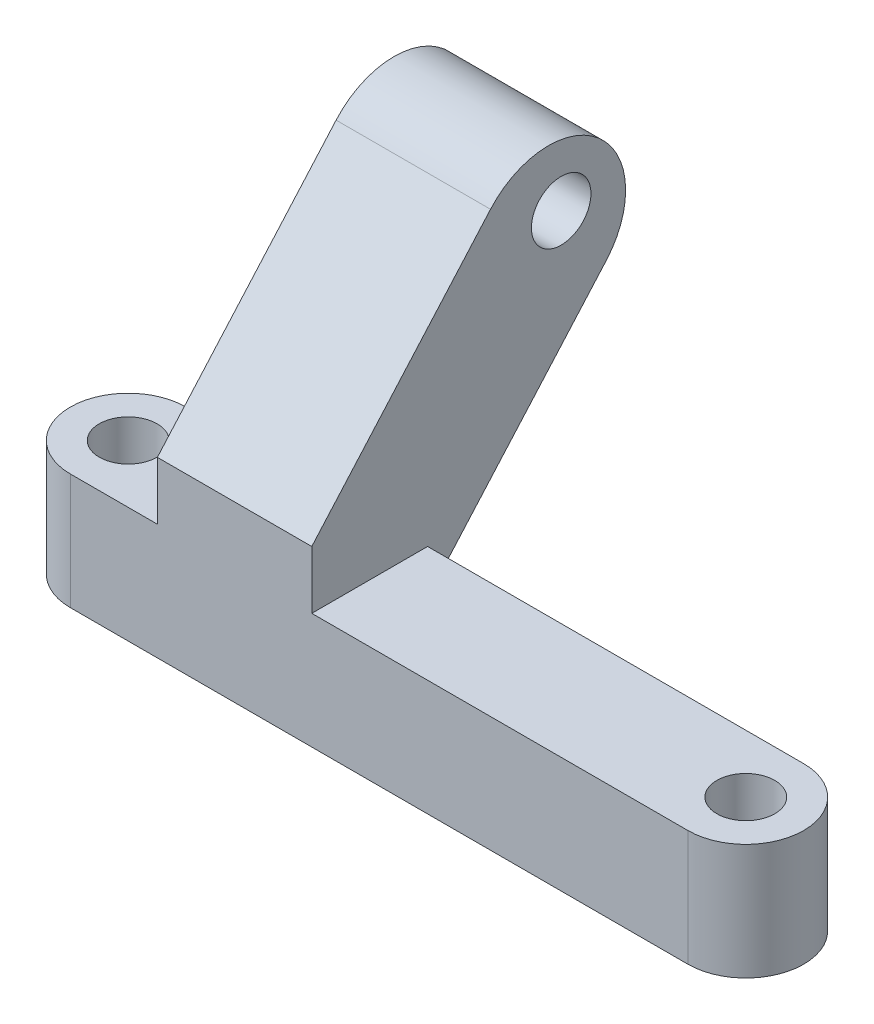
ISO-10303-21;
HEADER;
FILE_DESCRIPTION(('STEP AP214'),'2;1');
FILE_NAME('part.step','',(''),(''),'','','');
FILE_SCHEMA(('AUTOMOTIVE_DESIGN { 1 0 10303 214 1 1 1 1 }'));
ENDSEC;
DATA;
#1=APPLICATION_CONTEXT('core data for automotive mechanical design processes');
#2=APPLICATION_PROTOCOL_DEFINITION('international standard','automotive_design',2000,#1);
#3=PRODUCT_CONTEXT('',#1,'mechanical');
#4=PRODUCT('Part','Part','',(#3));
#5=PRODUCT_RELATED_PRODUCT_CATEGORY('part','',(#4));
#6=PRODUCT_DEFINITION_FORMATION('','',#4);
#7=PRODUCT_DEFINITION_CONTEXT('part definition',#1,'design');
#8=PRODUCT_DEFINITION('design','',#6,#7);
#9=PRODUCT_DEFINITION_SHAPE('','',#8);
#10=(LENGTH_UNIT() NAMED_UNIT(*) SI_UNIT(.MILLI.,.METRE.));
#11=(NAMED_UNIT(*) PLANE_ANGLE_UNIT() SI_UNIT($,.RADIAN.));
#12=(NAMED_UNIT(*) SI_UNIT($,.STERADIAN.) SOLID_ANGLE_UNIT());
#13=UNCERTAINTY_MEASURE_WITH_UNIT(LENGTH_MEASURE(1.E-05),#10,'distance_accuracy_value','');
#14=(GEOMETRIC_REPRESENTATION_CONTEXT(3) GLOBAL_UNCERTAINTY_ASSIGNED_CONTEXT((#13)) GLOBAL_UNIT_ASSIGNED_CONTEXT((#10,
#11,#12)) REPRESENTATION_CONTEXT('',''));
#15=CARTESIAN_POINT('',(0.,0.,0.));
#16=DIRECTION('',(0.,0.,1.));
#17=DIRECTION('',(1.,0.,0.));
#18=AXIS2_PLACEMENT_3D('',#15,#16,#17);
#19=CARTESIAN_POINT('',(0.,-6.,-3.));
#20=DIRECTION('',(0.,0.,1.));
#21=DIRECTION('',(1.,0.,0.));
#22=AXIS2_PLACEMENT_3D('',#19,#20,#21);
#23=PLANE('',#22);
#24=DIRECTION('',(0.,1.,0.));
#25=VECTOR('',#24,1.);
#26=CARTESIAN_POINT('',(-34.1646688359455,-6.,-3.));
#27=LINE('',#26,#25);
#28=CARTESIAN_POINT('',(-34.1646688359455,-2.2915026221292,-3.));
#29=VERTEX_POINT('',#28);
#30=CARTESIAN_POINT('',(-34.1646688359455,0.,-3.));
#31=VERTEX_POINT('',#30);
#32=EDGE_CURVE('E70',#29,#31,#27,.T.);
#33=ORIENTED_EDGE('',*,*,#32,.F.);
#34=DIRECTION('',(1.,0.,0.));
#35=VECTOR('',#34,1.);
#36=CARTESIAN_POINT('',(-34.1646688359455,-2.2915026221292,-3.));
#37=LINE('',#36,#35);
#38=CARTESIAN_POINT('',(-26.1646688359455,-2.2915026221292,-3.));
#39=VERTEX_POINT('',#38);
#40=EDGE_CURVE('E75',#29,#39,#37,.T.);
#41=ORIENTED_EDGE('',*,*,#40,.T.);
#42=DIRECTION('',(0.,1.,0.));
#43=VECTOR('',#42,1.);
#44=CARTESIAN_POINT('',(-26.1646688359455,-6.,-3.));
#45=LINE('',#44,#43);
#46=CARTESIAN_POINT('',(-26.1646688359455,0.,-3.));
#47=VERTEX_POINT('',#46);
#48=EDGE_CURVE('E157',#39,#47,#45,.T.);
#49=ORIENTED_EDGE('',*,*,#48,.T.);
#50=DIRECTION('',(1.,0.,0.));
#51=VECTOR('',#50,1.);
#52=CARTESIAN_POINT('',(0.,0.,-3.));
#53=LINE('',#52,#51);
#54=CARTESIAN_POINT('',(-6.67696888733747,0.,-3.));
#55=VERTEX_POINT('',#54);
#56=EDGE_CURVE('E200',#47,#55,#53,.T.);
#57=ORIENTED_EDGE('',*,*,#56,.T.);
#58=DIRECTION('',(0.,1.,0.));
#59=VECTOR('',#58,1.);
#60=CARTESIAN_POINT('',(-6.67696888733747,-6.,-3.));
#61=LINE('',#60,#59);
#62=CARTESIAN_POINT('',(-6.67696888733747,-6.,-3.));
#63=VERTEX_POINT('',#62);
#64=EDGE_CURVE('E221',#63,#55,#61,.T.);
#65=ORIENTED_EDGE('',*,*,#64,.F.);
#66=DIRECTION('',(1.,0.,0.));
#67=VECTOR('',#66,1.);
#68=CARTESIAN_POINT('',(0.,-6.,-3.));
#69=LINE('',#68,#67);
#70=CARTESIAN_POINT('',(-38.6769688873375,-6.,-3.));
#71=VERTEX_POINT('',#70);
#72=EDGE_CURVE('E240',#71,#63,#69,.T.);
#73=ORIENTED_EDGE('',*,*,#72,.F.);
#74=DIRECTION('',(0.,1.,0.));
#75=VECTOR('',#74,1.);
#76=CARTESIAN_POINT('',(-38.6769688873375,-6.,-3.));
#77=LINE('',#76,#75);
#78=CARTESIAN_POINT('',(-38.6769688873375,0.,-3.));
#79=VERTEX_POINT('',#78);
#80=EDGE_CURVE('E62',#71,#79,#77,.T.);
#81=ORIENTED_EDGE('',*,*,#80,.T.);
#82=EDGE_CURVE('E203',#79,#31,#53,.T.);
#83=ORIENTED_EDGE('',*,*,#82,.T.);
#84=EDGE_LOOP('',(#33,#41,#49,#57,#65,#73,#81,#83));
#85=FACE_BOUND('',#84,.T.);
#86=ADVANCED_FACE('F53',(#85),#23,.F.);
#87=CARTESIAN_POINT('',(0.,0.,0.));
#88=DIRECTION('',(0.,1.,0.));
#89=DIRECTION('',(0.,0.,1.));
#90=AXIS2_PLACEMENT_3D('',#87,#88,#89);
#91=PLANE('',#90);
#92=CARTESIAN_POINT('',(-6.67696888733747,0.,0.));
#93=DIRECTION('',(0.,1.,0.));
#94=DIRECTION('',(0.,0.,1.));
#95=AXIS2_PLACEMENT_3D('',#92,#93,#94);
#96=CIRCLE('',#95,1.5);
#97=CARTESIAN_POINT('',(-6.67696888733747,0.,1.5));
#98=VERTEX_POINT('',#97);
#99=EDGE_CURVE('E216',#98,#98,#96,.T.);
#100=ORIENTED_EDGE('',*,*,#99,.F.);
#101=EDGE_LOOP('',(#100));
#102=FACE_BOUND('',#101,.T.);
#103=ORIENTED_EDGE('',*,*,#56,.F.);
#104=DIRECTION('',(0.,0.,1.));
#105=VECTOR('',#104,1.);
#106=CARTESIAN_POINT('',(-26.1646688359455,0.,0.));
#107=LINE('',#106,#105);
#108=CARTESIAN_POINT('',(-26.1646688359455,0.,3.));
#109=VERTEX_POINT('',#108);
#110=EDGE_CURVE('E171',#47,#109,#107,.T.);
#111=ORIENTED_EDGE('',*,*,#110,.T.);
#112=DIRECTION('',(1.,0.,0.));
#113=VECTOR('',#112,1.);
#114=CARTESIAN_POINT('',(0.,0.,3.));
#115=LINE('',#114,#113);
#116=CARTESIAN_POINT('',(-6.67696888733747,0.,3.));
#117=VERTEX_POINT('',#116);
#118=EDGE_CURVE('E192',#109,#117,#115,.T.);
#119=ORIENTED_EDGE('',*,*,#118,.T.);
#120=CARTESIAN_POINT('',(-6.67696888733747,0.,0.));
#121=DIRECTION('',(0.,1.,0.));
#122=DIRECTION('',(0.,0.,1.));
#123=AXIS2_PLACEMENT_3D('',#120,#121,#122);
#124=CIRCLE('',#123,3.);
#125=EDGE_CURVE('E204',#117,#55,#124,.T.);
#126=ORIENTED_EDGE('',*,*,#125,.T.);
#127=EDGE_LOOP('',(#103,#111,#119,#126));
#128=FACE_BOUND('',#127,.T.);
#129=ADVANCED_FACE('F264',(#102,#128),#91,.T.);
#130=CARTESIAN_POINT('',(0.,-6.,3.));
#131=DIRECTION('',(0.,0.,1.));
#132=DIRECTION('',(1.,0.,0.));
#133=AXIS2_PLACEMENT_3D('',#130,#131,#132);
#134=PLANE('',#133);
#135=CARTESIAN_POINT('',(-38.6769688873375,0.,3.));
#136=VERTEX_POINT('',#135);
#137=CARTESIAN_POINT('',(-34.1646688359455,0.,3.));
#138=VERTEX_POINT('',#137);
#139=EDGE_CURVE('E196',#136,#138,#115,.T.);
#140=ORIENTED_EDGE('',*,*,#139,.F.);
#141=DIRECTION('',(0.,1.,0.));
#142=VECTOR('',#141,1.);
#143=CARTESIAN_POINT('',(-38.6769688873375,-6.,3.));
#144=LINE('',#143,#142);
#145=CARTESIAN_POINT('',(-38.6769688873375,-6.,3.));
#146=VERTEX_POINT('',#145);
#147=EDGE_CURVE('E12',#146,#136,#144,.T.);
#148=ORIENTED_EDGE('',*,*,#147,.F.);
#149=DIRECTION('',(1.,0.,0.));
#150=VECTOR('',#149,1.);
#151=CARTESIAN_POINT('',(0.,-6.,3.));
#152=LINE('',#151,#150);
#153=CARTESIAN_POINT('',(-6.67696888733747,-6.,3.));
#154=VERTEX_POINT('',#153);
#155=EDGE_CURVE('E218',#146,#154,#152,.T.);
#156=ORIENTED_EDGE('',*,*,#155,.T.);
#157=DIRECTION('',(0.,1.,0.));
#158=VECTOR('',#157,1.);
#159=CARTESIAN_POINT('',(-6.67696888733747,-6.,3.));
#160=LINE('',#159,#158);
#161=EDGE_CURVE('E224',#154,#117,#160,.T.);
#162=ORIENTED_EDGE('',*,*,#161,.T.);
#163=ORIENTED_EDGE('',*,*,#118,.F.);
#164=DIRECTION('',(0.,-1.,0.));
#165=VECTOR('',#164,1.);
#166=CARTESIAN_POINT('',(-26.1646688359455,3.,3.));
#167=LINE('',#166,#165);
#168=CARTESIAN_POINT('',(-26.1646688359455,3.,3.));
#169=VERTEX_POINT('',#168);
#170=EDGE_CURVE('E175',#169,#109,#167,.T.);
#171=ORIENTED_EDGE('',*,*,#170,.F.);
#172=DIRECTION('',(1.,0.,0.));
#173=VECTOR('',#172,1.);
#174=CARTESIAN_POINT('',(0.,3.,3.));
#175=LINE('',#174,#173);
#176=CARTESIAN_POINT('',(-34.1646688359455,3.,3.));
#177=VERTEX_POINT('',#176);
#178=EDGE_CURVE('E172',#177,#169,#175,.T.);
#179=ORIENTED_EDGE('',*,*,#178,.F.);
#180=DIRECTION('',(0.,-1.,0.));
#181=VECTOR('',#180,1.);
#182=CARTESIAN_POINT('',(-34.1646688359455,3.,3.));
#183=LINE('',#182,#181);
#184=EDGE_CURVE('E187',#177,#138,#183,.T.);
#185=ORIENTED_EDGE('',*,*,#184,.T.);
#186=EDGE_LOOP('',(#140,#148,#156,#162,#163,#171,#179,#185));
#187=FACE_BOUND('',#186,.T.);
#188=ADVANCED_FACE('F55',(#187),#134,.T.);
#189=CARTESIAN_POINT('',(-38.6769688873375,-6.,0.));
#190=DIRECTION('',(0.,1.,0.));
#191=DIRECTION('',(0.,0.,1.));
#192=AXIS2_PLACEMENT_3D('',#189,#190,#191);
#193=CYLINDRICAL_SURFACE('',#192,3.);
#194=CARTESIAN_POINT('',(-38.6769688873375,0.,0.));
#195=DIRECTION('',(0.,1.,0.));
#196=DIRECTION('',(0.,0.,1.));
#197=AXIS2_PLACEMENT_3D('',#194,#195,#196);
#198=CIRCLE('',#197,3.);
#199=EDGE_CURVE('E209',#79,#136,#198,.T.);
#200=ORIENTED_EDGE('',*,*,#199,.F.);
#201=ORIENTED_EDGE('',*,*,#80,.F.);
#202=CARTESIAN_POINT('',(-38.6769688873375,-6.,0.));
#203=DIRECTION('',(0.,1.,0.));
#204=DIRECTION('',(0.,0.,1.));
#205=AXIS2_PLACEMENT_3D('',#202,#203,#204);
#206=CIRCLE('',#205,3.);
#207=EDGE_CURVE('E237',#71,#146,#206,.T.);
#208=ORIENTED_EDGE('',*,*,#207,.T.);
#209=ORIENTED_EDGE('',*,*,#147,.T.);
#210=EDGE_LOOP('',(#200,#201,#208,#209));
#211=FACE_BOUND('',#210,.T.);
#212=ADVANCED_FACE('F255',(#211),#193,.T.);
#213=CARTESIAN_POINT('',(-38.6769688873375,-6.,0.));
#214=DIRECTION('',(0.,1.,0.));
#215=DIRECTION('',(0.,0.,1.));
#216=AXIS2_PLACEMENT_3D('',#213,#214,#215);
#217=CYLINDRICAL_SURFACE('',#216,1.5);
#218=CARTESIAN_POINT('',(-38.6769688873375,-6.,0.));
#219=DIRECTION('',(0.,1.,0.));
#220=DIRECTION('',(0.,0.,1.));
#221=AXIS2_PLACEMENT_3D('',#218,#219,#220);
#222=CIRCLE('',#221,1.5);
#223=CARTESIAN_POINT('',(-38.6769688873375,-6.,1.5));
#224=VERTEX_POINT('',#223);
#225=EDGE_CURVE('E234',#224,#224,#222,.T.);
#226=ORIENTED_EDGE('',*,*,#225,.F.);
#227=EDGE_LOOP('',(#226));
#228=FACE_BOUND('',#227,.T.);
#229=CARTESIAN_POINT('',(-38.6769688873375,0.,0.));
#230=DIRECTION('',(0.,1.,0.));
#231=DIRECTION('',(0.,0.,1.));
#232=AXIS2_PLACEMENT_3D('',#229,#230,#231);
#233=CIRCLE('',#232,1.5);
#234=CARTESIAN_POINT('',(-38.6769688873375,0.,1.5));
#235=VERTEX_POINT('',#234);
#236=EDGE_CURVE('E213',#235,#235,#233,.T.);
#237=ORIENTED_EDGE('',*,*,#236,.T.);
#238=EDGE_LOOP('',(#237));
#239=FACE_BOUND('',#238,.T.);
#240=ADVANCED_FACE('F293',(#228,#239),#217,.F.);
#241=CARTESIAN_POINT('',(-6.67696888733747,-6.,0.));
#242=DIRECTION('',(0.,1.,0.));
#243=DIRECTION('',(0.,0.,1.));
#244=AXIS2_PLACEMENT_3D('',#241,#242,#243);
#245=CYLINDRICAL_SURFACE('',#244,3.);
#246=ORIENTED_EDGE('',*,*,#125,.F.);
#247=ORIENTED_EDGE('',*,*,#161,.F.);
#248=CARTESIAN_POINT('',(-6.67696888733747,-6.,0.));
#249=DIRECTION('',(0.,1.,0.));
#250=DIRECTION('',(0.,0.,1.));
#251=AXIS2_PLACEMENT_3D('',#248,#249,#250);
#252=CIRCLE('',#251,3.);
#253=EDGE_CURVE('E242',#154,#63,#252,.T.);
#254=ORIENTED_EDGE('',*,*,#253,.T.);
#255=ORIENTED_EDGE('',*,*,#64,.T.);
#256=EDGE_LOOP('',(#246,#247,#254,#255));
#257=FACE_BOUND('',#256,.T.);
#258=ADVANCED_FACE('F262',(#257),#245,.T.);
#259=CARTESIAN_POINT('',(-6.67696888733747,-6.,0.));
#260=DIRECTION('',(0.,1.,0.));
#261=DIRECTION('',(0.,0.,1.));
#262=AXIS2_PLACEMENT_3D('',#259,#260,#261);
#263=CYLINDRICAL_SURFACE('',#262,1.5);
#264=CARTESIAN_POINT('',(-6.67696888733747,-6.,0.));
#265=DIRECTION('',(0.,1.,0.));
#266=DIRECTION('',(0.,0.,1.));
#267=AXIS2_PLACEMENT_3D('',#264,#265,#266);
#268=CIRCLE('',#267,1.5);
#269=CARTESIAN_POINT('',(-6.67696888733747,-6.,1.5));
#270=VERTEX_POINT('',#269);
#271=EDGE_CURVE('E227',#270,#270,#268,.T.);
#272=ORIENTED_EDGE('',*,*,#271,.F.);
#273=EDGE_LOOP('',(#272));
#274=FACE_BOUND('',#273,.T.);
#275=ORIENTED_EDGE('',*,*,#99,.T.);
#276=EDGE_LOOP('',(#275));
#277=FACE_BOUND('',#276,.T.);
#278=ADVANCED_FACE('F292',(#274,#277),#263,.F.);
#279=CARTESIAN_POINT('',(0.,-6.,0.));
#280=DIRECTION('',(0.,1.,0.));
#281=DIRECTION('',(0.,0.,1.));
#282=AXIS2_PLACEMENT_3D('',#279,#280,#281);
#283=PLANE('',#282);
#284=ORIENTED_EDGE('',*,*,#155,.F.);
#285=ORIENTED_EDGE('',*,*,#207,.F.);
#286=ORIENTED_EDGE('',*,*,#72,.T.);
#287=ORIENTED_EDGE('',*,*,#253,.F.);
#288=EDGE_LOOP('',(#284,#285,#286,#287));
#289=FACE_BOUND('',#288,.T.);
#290=ORIENTED_EDGE('',*,*,#225,.T.);
#291=EDGE_LOOP('',(#290));
#292=FACE_BOUND('',#291,.T.);
#293=ORIENTED_EDGE('',*,*,#271,.T.);
#294=EDGE_LOOP('',(#293));
#295=FACE_BOUND('',#294,.T.);
#296=ADVANCED_FACE('F251',(#289,#292,#295),#283,.F.);
#297=DIRECTION('',(0.,0.,1.));
#298=VECTOR('',#297,1.);
#299=CARTESIAN_POINT('',(-34.1646688359455,0.,0.));
#300=LINE('',#299,#298);
#301=EDGE_CURVE('E176',#31,#138,#300,.T.);
#302=ORIENTED_EDGE('',*,*,#301,.F.);
#303=ORIENTED_EDGE('',*,*,#82,.F.);
#304=ORIENTED_EDGE('',*,*,#199,.T.);
#305=ORIENTED_EDGE('',*,*,#139,.T.);
#306=EDGE_LOOP('',(#302,#303,#304,#305));
#307=FACE_BOUND('',#306,.T.);
#308=ORIENTED_EDGE('',*,*,#236,.F.);
#309=EDGE_LOOP('',(#308));
#310=FACE_BOUND('',#309,.T.);
#311=ADVANCED_FACE('F270',(#307,#310),#91,.T.);
#312=CARTESIAN_POINT('',(-26.1646688359455,3.,0.));
#313=DIRECTION('',(1.,0.,0.));
#314=DIRECTION('',(0.,0.,-1.));
#315=AXIS2_PLACEMENT_3D('',#312,#313,#314);
#316=PLANE('',#315);
#317=CARTESIAN_POINT('',(-26.1646688359455,11.6042486889354,-9.92156741649224));
#318=DIRECTION('',(1.,0.,0.));
#319=DIRECTION('',(0.,0.,-1.));
#320=AXIS2_PLACEMENT_3D('',#317,#318,#319);
#321=CIRCLE('',#320,1.54236434065057);
#322=CARTESIAN_POINT('',(-26.1646688359455,11.6042486889354,-11.4639317571428));
#323=VERTEX_POINT('',#322);
#324=EDGE_CURVE('E155',#323,#323,#321,.T.);
#325=ORIENTED_EDGE('',*,*,#324,.F.);
#326=EDGE_LOOP('',(#325));
#327=FACE_BOUND('',#326,.T.);
#328=ORIENTED_EDGE('',*,*,#110,.F.);
#329=ORIENTED_EDGE('',*,*,#48,.F.);
#330=DIRECTION('',(0.,-0.749999999999999,0.661437827766149));
#331=VECTOR('',#330,1.);
#332=CARTESIAN_POINT('',(-26.1646688359455,8.20849737787078,-12.2601295887261));
#333=LINE('',#332,#331);
#334=CARTESIAN_POINT('',(-26.1646688359455,8.20849737787078,-12.2601295887261));
#335=VERTEX_POINT('',#334);
#336=EDGE_CURVE('E160',#335,#39,#333,.T.);
#337=ORIENTED_EDGE('',*,*,#336,.F.);
#338=CARTESIAN_POINT('',(-26.1646688359455,10.8542486889354,-9.26012958872609));
#339=DIRECTION('',(1.,0.,0.));
#340=DIRECTION('',(0.,0.,-1.));
#341=AXIS2_PLACEMENT_3D('',#338,#339,#340);
#342=CIRCLE('',#341,4.);
#343=CARTESIAN_POINT('',(-26.1646688359455,13.5,-6.26012958872609));
#344=VERTEX_POINT('',#343);
#345=EDGE_CURVE('E137',#335,#344,#342,.T.);
#346=ORIENTED_EDGE('',*,*,#345,.T.);
#347=DIRECTION('',(0.,-0.749999999999999,0.661437827766149));
#348=VECTOR('',#347,1.);
#349=CARTESIAN_POINT('',(-26.1646688359455,13.5,-6.26012958872609));
#350=LINE('',#349,#348);
#351=EDGE_CURVE('E147',#344,#169,#350,.T.);
#352=ORIENTED_EDGE('',*,*,#351,.T.);
#353=ORIENTED_EDGE('',*,*,#170,.T.);
#354=EDGE_LOOP('',(#328,#329,#337,#346,#352,#353));
#355=FACE_BOUND('',#354,.T.);
#356=ADVANCED_FACE('F268',(#327,#355),#316,.T.);
#357=CARTESIAN_POINT('',(-34.1646688359455,3.,0.));
#358=DIRECTION('',(1.,0.,0.));
#359=DIRECTION('',(0.,0.,-1.));
#360=AXIS2_PLACEMENT_3D('',#357,#358,#359);
#361=PLANE('',#360);
#362=CARTESIAN_POINT('',(-34.1646688359455,11.6042486889354,-9.92156741649224));
#363=DIRECTION('',(1.,0.,0.));
#364=DIRECTION('',(0.,0.,-1.));
#365=AXIS2_PLACEMENT_3D('',#362,#363,#364);
#366=CIRCLE('',#365,1.54236434065057);
#367=CARTESIAN_POINT('',(-34.1646688359455,11.6042486889354,-11.4639317571428));
#368=VERTEX_POINT('',#367);
#369=EDGE_CURVE('E57',#368,#368,#366,.T.);
#370=ORIENTED_EDGE('',*,*,#369,.T.);
#371=EDGE_LOOP('',(#370));
#372=FACE_BOUND('',#371,.T.);
#373=ORIENTED_EDGE('',*,*,#32,.T.);
#374=ORIENTED_EDGE('',*,*,#301,.T.);
#375=ORIENTED_EDGE('',*,*,#184,.F.);
#376=DIRECTION('',(0.,-0.749999999999999,0.661437827766149));
#377=VECTOR('',#376,1.);
#378=CARTESIAN_POINT('',(-34.1646688359455,13.5,-6.26012958872609));
#379=LINE('',#378,#377);
#380=CARTESIAN_POINT('',(-34.1646688359455,13.5,-6.26012958872609));
#381=VERTEX_POINT('',#380);
#382=EDGE_CURVE('E146',#381,#177,#379,.T.);
#383=ORIENTED_EDGE('',*,*,#382,.F.);
#384=CARTESIAN_POINT('',(-34.1646688359455,10.8542486889354,-9.26012958872609));
#385=DIRECTION('',(1.,0.,0.));
#386=DIRECTION('',(0.,0.,-1.));
#387=AXIS2_PLACEMENT_3D('',#384,#385,#386);
#388=CIRCLE('',#387,4.);
#389=CARTESIAN_POINT('',(-34.1646688359455,8.20849737787078,-12.2601295887261));
#390=VERTEX_POINT('',#389);
#391=EDGE_CURVE('E135',#390,#381,#388,.T.);
#392=ORIENTED_EDGE('',*,*,#391,.F.);
#393=DIRECTION('',(0.,-0.749999999999999,0.661437827766149));
#394=VECTOR('',#393,1.);
#395=CARTESIAN_POINT('',(-34.1646688359455,8.20849737787078,-12.2601295887261));
#396=LINE('',#395,#394);
#397=EDGE_CURVE('E143',#390,#29,#396,.T.);
#398=ORIENTED_EDGE('',*,*,#397,.T.);
#399=EDGE_LOOP('',(#373,#374,#375,#383,#392,#398));
#400=FACE_BOUND('',#399,.T.);
#401=ADVANCED_FACE('F150',(#372,#400),#361,.F.);
#402=CARTESIAN_POINT('',(-34.1646688359455,10.8542486889354,-9.26012958872609));
#403=DIRECTION('',(1.,0.,0.));
#404=DIRECTION('',(0.,0.,-1.));
#405=AXIS2_PLACEMENT_3D('',#402,#403,#404);
#406=CYLINDRICAL_SURFACE('',#405,4.);
#407=ORIENTED_EDGE('',*,*,#345,.F.);
#408=DIRECTION('',(1.,0.,0.));
#409=VECTOR('',#408,1.);
#410=CARTESIAN_POINT('',(-34.1646688359455,8.20849737787078,-12.2601295887261));
#411=LINE('',#410,#409);
#412=EDGE_CURVE('E131',#390,#335,#411,.T.);
#413=ORIENTED_EDGE('',*,*,#412,.F.);
#414=ORIENTED_EDGE('',*,*,#391,.T.);
#415=DIRECTION('',(1.,0.,0.));
#416=VECTOR('',#415,1.);
#417=CARTESIAN_POINT('',(-34.1646688359455,13.5,-6.26012958872609));
#418=LINE('',#417,#416);
#419=EDGE_CURVE('E141',#381,#344,#418,.T.);
#420=ORIENTED_EDGE('',*,*,#419,.T.);
#421=EDGE_LOOP('',(#407,#413,#414,#420));
#422=FACE_BOUND('',#421,.T.);
#423=ADVANCED_FACE('F133',(#422),#406,.T.);
#424=CARTESIAN_POINT('',(-34.1646688359455,13.5,-6.26012958872609));
#425=DIRECTION('',(0.,0.661437827766149,0.749999999999999));
#426=DIRECTION('',(0.,-0.749999999999999,0.661437827766149));
#427=AXIS2_PLACEMENT_3D('',#424,#425,#426);
#428=PLANE('',#427);
#429=ORIENTED_EDGE('',*,*,#351,.F.);
#430=ORIENTED_EDGE('',*,*,#419,.F.);
#431=ORIENTED_EDGE('',*,*,#382,.T.);
#432=ORIENTED_EDGE('',*,*,#178,.T.);
#433=EDGE_LOOP('',(#429,#430,#431,#432));
#434=FACE_BOUND('',#433,.T.);
#435=ADVANCED_FACE('F267',(#434),#428,.T.);
#436=CARTESIAN_POINT('',(-34.1646688359455,8.20849737787078,-12.2601295887261));
#437=DIRECTION('',(0.,0.661437827766149,0.749999999999999));
#438=DIRECTION('',(0.,-0.749999999999999,0.661437827766149));
#439=AXIS2_PLACEMENT_3D('',#436,#437,#438);
#440=PLANE('',#439);
#441=ORIENTED_EDGE('',*,*,#336,.T.);
#442=ORIENTED_EDGE('',*,*,#40,.F.);
#443=ORIENTED_EDGE('',*,*,#397,.F.);
#444=ORIENTED_EDGE('',*,*,#412,.T.);
#445=EDGE_LOOP('',(#441,#442,#443,#444));
#446=FACE_BOUND('',#445,.T.);
#447=ADVANCED_FACE('F144',(#446),#440,.F.);
#448=CARTESIAN_POINT('',(-38.1646688359455,11.6042486889354,-9.92156741649224));
#449=DIRECTION('',(1.,0.,0.));
#450=DIRECTION('',(0.,0.,-1.));
#451=AXIS2_PLACEMENT_3D('',#448,#449,#450);
#452=CYLINDRICAL_SURFACE('',#451,1.54236434065057);
#453=ORIENTED_EDGE('',*,*,#324,.T.);
#454=EDGE_LOOP('',(#453));
#455=FACE_BOUND('',#454,.T.);
#456=ORIENTED_EDGE('',*,*,#369,.F.);
#457=EDGE_LOOP('',(#456));
#458=FACE_BOUND('',#457,.T.);
#459=ADVANCED_FACE('F332',(#455,#458),#452,.F.);
#460=CLOSED_SHELL('',(#86,#129,#188,#212,#240,#258,#278,#296,#311,#356,#401,#423,#435,#447,#459));
#461=MANIFOLD_SOLID_BREP('B2',#460);
#462=ADVANCED_BREP_SHAPE_REPRESENTATION('',(#18,#461),#14);
#463=SHAPE_DEFINITION_REPRESENTATION(#9,#462);
ENDSEC;
END-ISO-10303-21;
